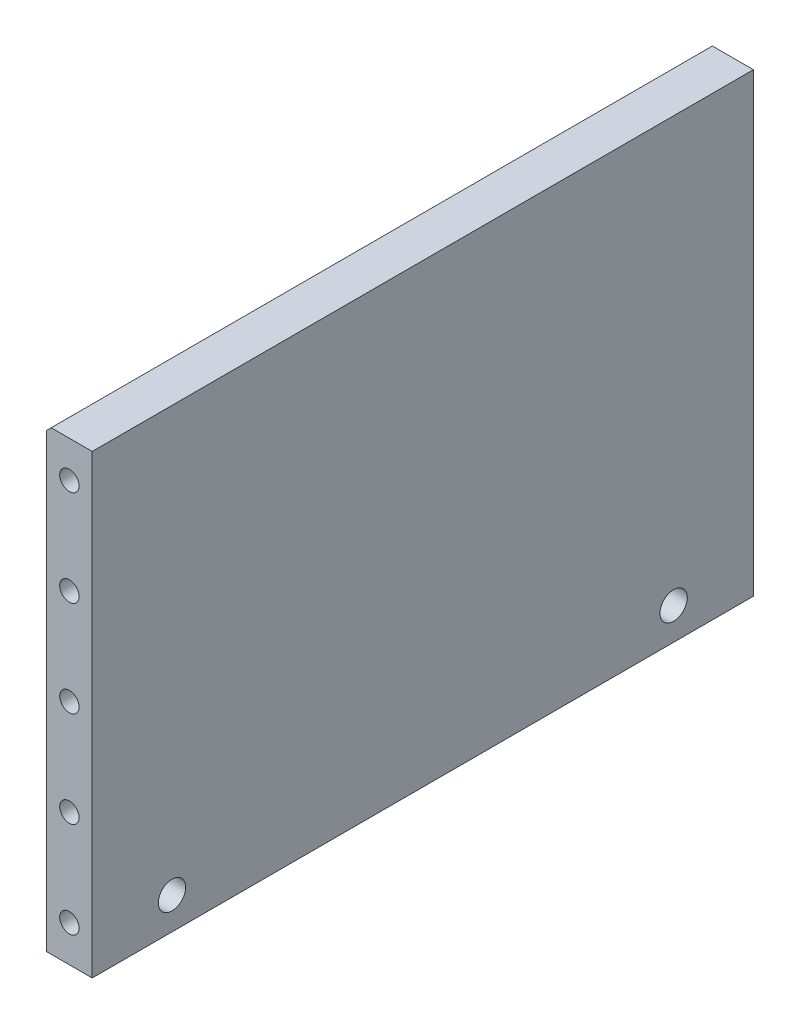
ISO-10303-21;
HEADER;
FILE_DESCRIPTION(('STEP AP214'),'2;1');
FILE_NAME('part.step','',(''),(''),'','','');
FILE_SCHEMA(('AUTOMOTIVE_DESIGN { 1 0 10303 214 1 1 1 1 }'));
ENDSEC;
DATA;
#1=APPLICATION_CONTEXT('core data for automotive mechanical design processes');
#2=APPLICATION_PROTOCOL_DEFINITION('international standard','automotive_design',2000,#1);
#3=PRODUCT_CONTEXT('',#1,'mechanical');
#4=PRODUCT('Part','Part','',(#3));
#5=PRODUCT_RELATED_PRODUCT_CATEGORY('part','',(#4));
#6=PRODUCT_DEFINITION_FORMATION('','',#4);
#7=PRODUCT_DEFINITION_CONTEXT('part definition',#1,'design');
#8=PRODUCT_DEFINITION('design','',#6,#7);
#9=PRODUCT_DEFINITION_SHAPE('','',#8);
#10=(LENGTH_UNIT() NAMED_UNIT(*) SI_UNIT(.MILLI.,.METRE.));
#11=(NAMED_UNIT(*) PLANE_ANGLE_UNIT() SI_UNIT($,.RADIAN.));
#12=(NAMED_UNIT(*) SI_UNIT($,.STERADIAN.) SOLID_ANGLE_UNIT());
#13=UNCERTAINTY_MEASURE_WITH_UNIT(LENGTH_MEASURE(1.E-05),#10,'distance_accuracy_value','');
#14=(GEOMETRIC_REPRESENTATION_CONTEXT(3) GLOBAL_UNCERTAINTY_ASSIGNED_CONTEXT((#13)) GLOBAL_UNIT_ASSIGNED_CONTEXT((#10,
#11,#12)) REPRESENTATION_CONTEXT('',''));
#15=CARTESIAN_POINT('',(0.,0.,0.));
#16=DIRECTION('',(0.,0.,1.));
#17=DIRECTION('',(1.,0.,0.));
#18=AXIS2_PLACEMENT_3D('',#15,#16,#17);
#19=CARTESIAN_POINT('',(20.,0.,0.));
#20=DIRECTION('',(0.,0.,-1.));
#21=DIRECTION('',(-1.,0.,0.));
#22=AXIS2_PLACEMENT_3D('',#19,#20,#21);
#23=PLANE('',#22);
#24=CARTESIAN_POINT('',(10.,184.,0.));
#25=DIRECTION('',(0.,0.,1.));
#26=DIRECTION('',(1.,0.,0.));
#27=AXIS2_PLACEMENT_3D('',#24,#25,#26);
#28=CIRCLE('',#27,4.24999999999999);
#29=CARTESIAN_POINT('',(14.25,184.,0.));
#30=VERTEX_POINT('',#29);
#31=EDGE_CURVE('E156',#30,#30,#28,.T.);
#32=ORIENTED_EDGE('',*,*,#31,.F.);
#33=EDGE_LOOP('',(#32));
#34=FACE_BOUND('',#33,.T.);
#35=CARTESIAN_POINT('',(10.,16.,0.));
#36=DIRECTION('',(0.,0.,1.));
#37=DIRECTION('',(1.,0.,0.));
#38=AXIS2_PLACEMENT_3D('',#35,#36,#37);
#39=CIRCLE('',#38,4.24999999999999);
#40=CARTESIAN_POINT('',(14.25,16.,0.));
#41=VERTEX_POINT('',#40);
#42=EDGE_CURVE('E162',#41,#41,#39,.T.);
#43=ORIENTED_EDGE('',*,*,#42,.F.);
#44=EDGE_LOOP('',(#43));
#45=FACE_BOUND('',#44,.T.);
#46=CARTESIAN_POINT('',(10.,58.,0.));
#47=DIRECTION('',(0.,0.,1.));
#48=DIRECTION('',(1.,0.,0.));
#49=AXIS2_PLACEMENT_3D('',#46,#47,#48);
#50=CIRCLE('',#49,4.24999999999999);
#51=CARTESIAN_POINT('',(14.25,58.,0.));
#52=VERTEX_POINT('',#51);
#53=EDGE_CURVE('E168',#52,#52,#50,.T.);
#54=ORIENTED_EDGE('',*,*,#53,.F.);
#55=EDGE_LOOP('',(#54));
#56=FACE_BOUND('',#55,.T.);
#57=CARTESIAN_POINT('',(10.,142.,0.));
#58=DIRECTION('',(0.,0.,1.));
#59=DIRECTION('',(1.,0.,0.));
#60=AXIS2_PLACEMENT_3D('',#57,#58,#59);
#61=CIRCLE('',#60,4.24999999999999);
#62=CARTESIAN_POINT('',(14.25,142.,0.));
#63=VERTEX_POINT('',#62);
#64=EDGE_CURVE('E174',#63,#63,#61,.T.);
#65=ORIENTED_EDGE('',*,*,#64,.F.);
#66=EDGE_LOOP('',(#65));
#67=FACE_BOUND('',#66,.T.);
#68=CARTESIAN_POINT('',(10.,100.,0.));
#69=DIRECTION('',(0.,0.,1.));
#70=DIRECTION('',(1.,0.,0.));
#71=AXIS2_PLACEMENT_3D('',#68,#69,#70);
#72=CIRCLE('',#71,4.24999999999999);
#73=CARTESIAN_POINT('',(14.25,100.,0.));
#74=VERTEX_POINT('',#73);
#75=EDGE_CURVE('E180',#74,#74,#72,.T.);
#76=ORIENTED_EDGE('',*,*,#75,.F.);
#77=EDGE_LOOP('',(#76));
#78=FACE_BOUND('',#77,.T.);
#79=DIRECTION('',(-1.,0.,0.));
#80=VECTOR('',#79,1.);
#81=CARTESIAN_POINT('',(20.,200.,0.));
#82=LINE('',#81,#80);
#83=CARTESIAN_POINT('',(20.,200.,0.));
#84=VERTEX_POINT('',#83);
#85=CARTESIAN_POINT('',(2.,200.,0.));
#86=VERTEX_POINT('',#85);
#87=EDGE_CURVE('E197',#84,#86,#82,.T.);
#88=ORIENTED_EDGE('',*,*,#87,.T.);
#89=DIRECTION('',(-0.707106781186543,-0.707106781186552,0.));
#90=VECTOR('',#89,1.);
#91=CARTESIAN_POINT('',(2.,200.,0.));
#92=LINE('',#91,#90);
#93=CARTESIAN_POINT('',(0.,198.,0.));
#94=VERTEX_POINT('',#93);
#95=EDGE_CURVE('E69',#86,#94,#92,.T.);
#96=ORIENTED_EDGE('',*,*,#95,.T.);
#97=DIRECTION('',(0.,-1.,0.));
#98=VECTOR('',#97,1.);
#99=CARTESIAN_POINT('',(0.,0.,0.));
#100=LINE('',#99,#98);
#101=CARTESIAN_POINT('',(0.,0.,0.));
#102=VERTEX_POINT('',#101);
#103=EDGE_CURVE('E186',#94,#102,#100,.T.);
#104=ORIENTED_EDGE('',*,*,#103,.T.);
#105=DIRECTION('',(-1.,0.,0.));
#106=VECTOR('',#105,1.);
#107=CARTESIAN_POINT('',(20.,0.,0.));
#108=LINE('',#107,#106);
#109=CARTESIAN_POINT('',(20.,0.,0.));
#110=VERTEX_POINT('',#109);
#111=EDGE_CURVE('E209',#110,#102,#108,.T.);
#112=ORIENTED_EDGE('',*,*,#111,.F.);
#113=DIRECTION('',(0.,-1.,0.));
#114=VECTOR('',#113,1.);
#115=CARTESIAN_POINT('',(20.,0.,0.));
#116=LINE('',#115,#114);
#117=EDGE_CURVE('E187',#84,#110,#116,.T.);
#118=ORIENTED_EDGE('',*,*,#117,.F.);
#119=EDGE_LOOP('',(#88,#96,#104,#112,#118));
#120=FACE_BOUND('',#119,.T.);
#121=ADVANCED_FACE('F47',(#34,#45,#56,#67,#78,#120),#23,.F.);
#122=CARTESIAN_POINT('',(20.,0.,0.));
#123=DIRECTION('',(0.,1.,0.));
#124=DIRECTION('',(0.,0.,1.));
#125=AXIS2_PLACEMENT_3D('',#122,#123,#124);
#126=PLANE('',#125);
#127=DIRECTION('',(0.,0.,-1.));
#128=VECTOR('',#127,1.);
#129=CARTESIAN_POINT('',(0.,0.,0.));
#130=LINE('',#129,#128);
#131=CARTESIAN_POINT('',(0.,0.,-290.));
#132=VERTEX_POINT('',#131);
#133=EDGE_CURVE('E199',#102,#132,#130,.T.);
#134=ORIENTED_EDGE('',*,*,#133,.T.);
#135=DIRECTION('',(-1.,0.,0.));
#136=VECTOR('',#135,1.);
#137=CARTESIAN_POINT('',(20.,0.,-290.));
#138=LINE('',#137,#136);
#139=CARTESIAN_POINT('',(20.,0.,-290.));
#140=VERTEX_POINT('',#139);
#141=EDGE_CURVE('E206',#140,#132,#138,.T.);
#142=ORIENTED_EDGE('',*,*,#141,.F.);
#143=DIRECTION('',(0.,0.,-1.));
#144=VECTOR('',#143,1.);
#145=CARTESIAN_POINT('',(20.,0.,0.));
#146=LINE('',#145,#144);
#147=EDGE_CURVE('E190',#110,#140,#146,.T.);
#148=ORIENTED_EDGE('',*,*,#147,.F.);
#149=ORIENTED_EDGE('',*,*,#111,.T.);
#150=EDGE_LOOP('',(#134,#142,#148,#149));
#151=FACE_BOUND('',#150,.T.);
#152=ADVANCED_FACE('F252',(#151),#126,.F.);
#153=CARTESIAN_POINT('',(20.,0.,-290.));
#154=DIRECTION('',(0.,0.,1.));
#155=DIRECTION('',(1.,0.,0.));
#156=AXIS2_PLACEMENT_3D('',#153,#154,#155);
#157=PLANE('',#156);
#158=CARTESIAN_POINT('',(10.,184.,-290.));
#159=DIRECTION('',(0.,0.,-1.));
#160=DIRECTION('',(-1.,0.,0.));
#161=AXIS2_PLACEMENT_3D('',#158,#159,#160);
#162=CIRCLE('',#161,4.24999999999999);
#163=CARTESIAN_POINT('',(5.75000000000001,184.,-290.));
#164=VERTEX_POINT('',#163);
#165=EDGE_CURVE('E126',#164,#164,#162,.T.);
#166=ORIENTED_EDGE('',*,*,#165,.F.);
#167=EDGE_LOOP('',(#166));
#168=FACE_BOUND('',#167,.T.);
#169=CARTESIAN_POINT('',(10.,16.,-290.));
#170=DIRECTION('',(0.,0.,-1.));
#171=DIRECTION('',(-1.,0.,0.));
#172=AXIS2_PLACEMENT_3D('',#169,#170,#171);
#173=CIRCLE('',#172,4.24999999999999);
#174=CARTESIAN_POINT('',(5.75000000000001,16.,-290.));
#175=VERTEX_POINT('',#174);
#176=EDGE_CURVE('E125',#175,#175,#173,.T.);
#177=ORIENTED_EDGE('',*,*,#176,.F.);
#178=EDGE_LOOP('',(#177));
#179=FACE_BOUND('',#178,.T.);
#180=CARTESIAN_POINT('',(10.,58.,-290.));
#181=DIRECTION('',(0.,0.,-1.));
#182=DIRECTION('',(-1.,0.,0.));
#183=AXIS2_PLACEMENT_3D('',#180,#181,#182);
#184=CIRCLE('',#183,4.24999999999999);
#185=CARTESIAN_POINT('',(5.75000000000001,58.,-290.));
#186=VERTEX_POINT('',#185);
#187=EDGE_CURVE('E138',#186,#186,#184,.T.);
#188=ORIENTED_EDGE('',*,*,#187,.F.);
#189=EDGE_LOOP('',(#188));
#190=FACE_BOUND('',#189,.T.);
#191=CARTESIAN_POINT('',(10.,142.,-290.));
#192=DIRECTION('',(0.,0.,-1.));
#193=DIRECTION('',(-1.,0.,0.));
#194=AXIS2_PLACEMENT_3D('',#191,#192,#193);
#195=CIRCLE('',#194,4.24999999999999);
#196=CARTESIAN_POINT('',(5.75000000000001,142.,-290.));
#197=VERTEX_POINT('',#196);
#198=EDGE_CURVE('E144',#197,#197,#195,.T.);
#199=ORIENTED_EDGE('',*,*,#198,.F.);
#200=EDGE_LOOP('',(#199));
#201=FACE_BOUND('',#200,.T.);
#202=CARTESIAN_POINT('',(10.,100.,-290.));
#203=DIRECTION('',(0.,0.,-1.));
#204=DIRECTION('',(-1.,0.,0.));
#205=AXIS2_PLACEMENT_3D('',#202,#203,#204);
#206=CIRCLE('',#205,4.24999999999999);
#207=CARTESIAN_POINT('',(5.75000000000001,100.,-290.));
#208=VERTEX_POINT('',#207);
#209=EDGE_CURVE('E150',#208,#208,#206,.T.);
#210=ORIENTED_EDGE('',*,*,#209,.F.);
#211=EDGE_LOOP('',(#210));
#212=FACE_BOUND('',#211,.T.);
#213=DIRECTION('',(0.,1.,0.));
#214=VECTOR('',#213,1.);
#215=CARTESIAN_POINT('',(0.,0.,-290.));
#216=LINE('',#215,#214);
#217=CARTESIAN_POINT('',(0.,198.,-290.));
#218=VERTEX_POINT('',#217);
#219=EDGE_CURVE('E191',#132,#218,#216,.T.);
#220=ORIENTED_EDGE('',*,*,#219,.T.);
#221=DIRECTION('',(0.707106781186543,0.707106781186552,0.));
#222=VECTOR('',#221,1.);
#223=CARTESIAN_POINT('',(2.,200.,-290.));
#224=LINE('',#223,#222);
#225=CARTESIAN_POINT('',(2.,200.,-290.));
#226=VERTEX_POINT('',#225);
#227=EDGE_CURVE('E11',#218,#226,#224,.T.);
#228=ORIENTED_EDGE('',*,*,#227,.T.);
#229=DIRECTION('',(-1.,0.,0.));
#230=VECTOR('',#229,1.);
#231=CARTESIAN_POINT('',(20.,200.,-290.));
#232=LINE('',#231,#230);
#233=CARTESIAN_POINT('',(20.,200.,-290.));
#234=VERTEX_POINT('',#233);
#235=EDGE_CURVE('E203',#234,#226,#232,.T.);
#236=ORIENTED_EDGE('',*,*,#235,.F.);
#237=DIRECTION('',(0.,1.,0.));
#238=VECTOR('',#237,1.);
#239=CARTESIAN_POINT('',(20.,0.,-290.));
#240=LINE('',#239,#238);
#241=EDGE_CURVE('E193',#140,#234,#240,.T.);
#242=ORIENTED_EDGE('',*,*,#241,.F.);
#243=ORIENTED_EDGE('',*,*,#141,.T.);
#244=EDGE_LOOP('',(#220,#228,#236,#242,#243));
#245=FACE_BOUND('',#244,.T.);
#246=ADVANCED_FACE('F259',(#168,#179,#190,#201,#212,#245),#157,.F.);
#247=CARTESIAN_POINT('',(20.,200.,0.));
#248=DIRECTION('',(0.,-1.,0.));
#249=DIRECTION('',(0.,0.,-1.));
#250=AXIS2_PLACEMENT_3D('',#247,#248,#249);
#251=PLANE('',#250);
#252=ORIENTED_EDGE('',*,*,#235,.T.);
#253=DIRECTION('',(0.,0.,1.));
#254=VECTOR('',#253,1.);
#255=CARTESIAN_POINT('',(2.,200.,0.));
#256=LINE('',#255,#254);
#257=EDGE_CURVE('E212',#226,#86,#256,.T.);
#258=ORIENTED_EDGE('',*,*,#257,.T.);
#259=ORIENTED_EDGE('',*,*,#87,.F.);
#260=DIRECTION('',(0.,0.,1.));
#261=VECTOR('',#260,1.);
#262=CARTESIAN_POINT('',(20.,200.,0.));
#263=LINE('',#262,#261);
#264=EDGE_CURVE('E195',#234,#84,#263,.T.);
#265=ORIENTED_EDGE('',*,*,#264,.F.);
#266=EDGE_LOOP('',(#252,#258,#259,#265));
#267=FACE_BOUND('',#266,.T.);
#268=ADVANCED_FACE('F266',(#267),#251,.F.);
#269=CARTESIAN_POINT('',(20.,200.,0.));
#270=DIRECTION('',(-1.,0.,0.));
#271=DIRECTION('',(0.,0.,1.));
#272=AXIS2_PLACEMENT_3D('',#269,#270,#271);
#273=PLANE('',#272);
#274=CARTESIAN_POINT('',(20.,14.,-35.));
#275=DIRECTION('',(1.,0.,0.));
#276=DIRECTION('',(0.,0.,-1.));
#277=AXIS2_PLACEMENT_3D('',#274,#275,#276);
#278=CIRCLE('',#277,5.99999999999999);
#279=CARTESIAN_POINT('',(20.,14.,-41.));
#280=VERTEX_POINT('',#279);
#281=EDGE_CURVE('E378',#280,#280,#278,.T.);
#282=ORIENTED_EDGE('',*,*,#281,.F.);
#283=EDGE_LOOP('',(#282));
#284=FACE_BOUND('',#283,.T.);
#285=CARTESIAN_POINT('',(20.,14.,-255.));
#286=DIRECTION('',(1.,0.,0.));
#287=DIRECTION('',(0.,0.,-1.));
#288=AXIS2_PLACEMENT_3D('',#285,#286,#287);
#289=CIRCLE('',#288,5.99999999999999);
#290=CARTESIAN_POINT('',(20.,14.,-261.));
#291=VERTEX_POINT('',#290);
#292=EDGE_CURVE('E221',#291,#291,#289,.T.);
#293=ORIENTED_EDGE('',*,*,#292,.F.);
#294=EDGE_LOOP('',(#293));
#295=FACE_BOUND('',#294,.T.);
#296=ORIENTED_EDGE('',*,*,#117,.T.);
#297=ORIENTED_EDGE('',*,*,#147,.T.);
#298=ORIENTED_EDGE('',*,*,#241,.T.);
#299=ORIENTED_EDGE('',*,*,#264,.T.);
#300=EDGE_LOOP('',(#296,#297,#298,#299));
#301=FACE_BOUND('',#300,.T.);
#302=ADVANCED_FACE('F270',(#284,#295,#301),#273,.F.);
#303=CARTESIAN_POINT('',(0.,200.,0.));
#304=DIRECTION('',(-1.,0.,0.));
#305=DIRECTION('',(0.,0.,1.));
#306=AXIS2_PLACEMENT_3D('',#303,#304,#305);
#307=PLANE('',#306);
#308=CARTESIAN_POINT('',(0.,14.,-35.));
#309=DIRECTION('',(-1.,0.,0.));
#310=DIRECTION('',(0.,0.,1.));
#311=AXIS2_PLACEMENT_3D('',#308,#309,#310);
#312=CIRCLE('',#311,5.99999999999999);
#313=CARTESIAN_POINT('',(0.,14.,-29.));
#314=VERTEX_POINT('',#313);
#315=EDGE_CURVE('E374',#314,#314,#312,.T.);
#316=ORIENTED_EDGE('',*,*,#315,.F.);
#317=EDGE_LOOP('',(#316));
#318=FACE_BOUND('',#317,.T.);
#319=CARTESIAN_POINT('',(0.,14.,-255.));
#320=DIRECTION('',(-1.,0.,0.));
#321=DIRECTION('',(0.,0.,1.));
#322=AXIS2_PLACEMENT_3D('',#319,#320,#321);
#323=CIRCLE('',#322,5.99999999999999);
#324=CARTESIAN_POINT('',(0.,14.,-249.));
#325=VERTEX_POINT('',#324);
#326=EDGE_CURVE('E132',#325,#325,#323,.T.);
#327=ORIENTED_EDGE('',*,*,#326,.F.);
#328=EDGE_LOOP('',(#327));
#329=FACE_BOUND('',#328,.T.);
#330=ORIENTED_EDGE('',*,*,#103,.F.);
#331=DIRECTION('',(0.,0.,-1.));
#332=VECTOR('',#331,1.);
#333=CARTESIAN_POINT('',(0.,198.,-290.));
#334=LINE('',#333,#332);
#335=EDGE_CURVE('E55',#94,#218,#334,.T.);
#336=ORIENTED_EDGE('',*,*,#335,.T.);
#337=ORIENTED_EDGE('',*,*,#219,.F.);
#338=ORIENTED_EDGE('',*,*,#133,.F.);
#339=EDGE_LOOP('',(#330,#336,#337,#338));
#340=FACE_BOUND('',#339,.T.);
#341=ADVANCED_FACE('F272',(#318,#329,#340),#307,.T.);
#342=CARTESIAN_POINT('',(10.,100.,-27.5));
#343=DIRECTION('',(0.,0.,1.));
#344=DIRECTION('',(1.,0.,0.));
#345=AXIS2_PLACEMENT_3D('',#342,#343,#344);
#346=CONICAL_SURFACE('',#345,4.24999999999999,1.02974425867665);
#347=CARTESIAN_POINT('',(9.99999999999999,100.,-30.0536576308671));
#348=VERTEX_POINT('',#347);
#349=VERTEX_LOOP('',#348);
#350=FACE_BOUND('',#349,.T.);
#351=CARTESIAN_POINT('',(10.,100.,-27.5));
#352=DIRECTION('',(0.,0.,1.));
#353=DIRECTION('',(1.,0.,0.));
#354=AXIS2_PLACEMENT_3D('',#351,#352,#353);
#355=CIRCLE('',#354,4.24999999999999);
#356=CARTESIAN_POINT('',(14.25,100.,-27.5));
#357=VERTEX_POINT('',#356);
#358=EDGE_CURVE('E183',#357,#357,#355,.T.);
#359=ORIENTED_EDGE('',*,*,#358,.T.);
#360=EDGE_LOOP('',(#359));
#361=FACE_BOUND('',#360,.T.);
#362=ADVANCED_FACE('F275',(#350,#361),#346,.F.);
#363=CARTESIAN_POINT('',(10.,100.,0.));
#364=DIRECTION('',(0.,0.,1.));
#365=DIRECTION('',(1.,0.,0.));
#366=AXIS2_PLACEMENT_3D('',#363,#364,#365);
#367=CYLINDRICAL_SURFACE('',#366,4.24999999999999);
#368=ORIENTED_EDGE('',*,*,#358,.F.);
#369=EDGE_LOOP('',(#368));
#370=FACE_BOUND('',#369,.T.);
#371=ORIENTED_EDGE('',*,*,#75,.T.);
#372=EDGE_LOOP('',(#371));
#373=FACE_BOUND('',#372,.T.);
#374=ADVANCED_FACE('F282',(#370,#373),#367,.F.);
#375=CARTESIAN_POINT('',(10.,142.,-27.5));
#376=DIRECTION('',(0.,0.,1.));
#377=DIRECTION('',(1.,0.,0.));
#378=AXIS2_PLACEMENT_3D('',#375,#376,#377);
#379=CONICAL_SURFACE('',#378,4.24999999999999,1.02974425867665);
#380=CARTESIAN_POINT('',(9.99999999999999,142.,-30.0536576308671));
#381=VERTEX_POINT('',#380);
#382=VERTEX_LOOP('',#381);
#383=FACE_BOUND('',#382,.T.);
#384=CARTESIAN_POINT('',(10.,142.,-27.5));
#385=DIRECTION('',(0.,0.,1.));
#386=DIRECTION('',(1.,0.,0.));
#387=AXIS2_PLACEMENT_3D('',#384,#385,#386);
#388=CIRCLE('',#387,4.24999999999999);
#389=CARTESIAN_POINT('',(14.25,142.,-27.5));
#390=VERTEX_POINT('',#389);
#391=EDGE_CURVE('E177',#390,#390,#388,.T.);
#392=ORIENTED_EDGE('',*,*,#391,.T.);
#393=EDGE_LOOP('',(#392));
#394=FACE_BOUND('',#393,.T.);
#395=ADVANCED_FACE('F286',(#383,#394),#379,.F.);
#396=CARTESIAN_POINT('',(10.,142.,0.));
#397=DIRECTION('',(0.,0.,1.));
#398=DIRECTION('',(1.,0.,0.));
#399=AXIS2_PLACEMENT_3D('',#396,#397,#398);
#400=CYLINDRICAL_SURFACE('',#399,4.24999999999999);
#401=ORIENTED_EDGE('',*,*,#391,.F.);
#402=EDGE_LOOP('',(#401));
#403=FACE_BOUND('',#402,.T.);
#404=ORIENTED_EDGE('',*,*,#64,.T.);
#405=EDGE_LOOP('',(#404));
#406=FACE_BOUND('',#405,.T.);
#407=ADVANCED_FACE('F290',(#403,#406),#400,.F.);
#408=CARTESIAN_POINT('',(10.,58.,-27.5));
#409=DIRECTION('',(0.,0.,1.));
#410=DIRECTION('',(1.,0.,0.));
#411=AXIS2_PLACEMENT_3D('',#408,#409,#410);
#412=CONICAL_SURFACE('',#411,4.24999999999999,1.02974425867665);
#413=CARTESIAN_POINT('',(9.99999999999999,58.,-30.0536576308671));
#414=VERTEX_POINT('',#413);
#415=VERTEX_LOOP('',#414);
#416=FACE_BOUND('',#415,.T.);
#417=CARTESIAN_POINT('',(10.,58.,-27.5));
#418=DIRECTION('',(0.,0.,1.));
#419=DIRECTION('',(1.,0.,0.));
#420=AXIS2_PLACEMENT_3D('',#417,#418,#419);
#421=CIRCLE('',#420,4.24999999999999);
#422=CARTESIAN_POINT('',(14.25,58.,-27.5));
#423=VERTEX_POINT('',#422);
#424=EDGE_CURVE('E171',#423,#423,#421,.T.);
#425=ORIENTED_EDGE('',*,*,#424,.T.);
#426=EDGE_LOOP('',(#425));
#427=FACE_BOUND('',#426,.T.);
#428=ADVANCED_FACE('F294',(#416,#427),#412,.F.);
#429=CARTESIAN_POINT('',(10.,58.,0.));
#430=DIRECTION('',(0.,0.,1.));
#431=DIRECTION('',(1.,0.,0.));
#432=AXIS2_PLACEMENT_3D('',#429,#430,#431);
#433=CYLINDRICAL_SURFACE('',#432,4.24999999999999);
#434=ORIENTED_EDGE('',*,*,#424,.F.);
#435=EDGE_LOOP('',(#434));
#436=FACE_BOUND('',#435,.T.);
#437=ORIENTED_EDGE('',*,*,#53,.T.);
#438=EDGE_LOOP('',(#437));
#439=FACE_BOUND('',#438,.T.);
#440=ADVANCED_FACE('F298',(#436,#439),#433,.F.);
#441=CARTESIAN_POINT('',(10.,16.,-27.5));
#442=DIRECTION('',(0.,0.,1.));
#443=DIRECTION('',(1.,0.,0.));
#444=AXIS2_PLACEMENT_3D('',#441,#442,#443);
#445=CONICAL_SURFACE('',#444,4.24999999999999,1.02974425867665);
#446=CARTESIAN_POINT('',(8.87440916931204,14.7629046936816,-29.0486990014968));
#447=CARTESIAN_POINT('',(8.83800836371475,14.8094561464174,-29.0546668345114));
#448=CARTESIAN_POINT('',(8.80529993592373,14.8588488395052,-29.0615561672032));
#449=CARTESIAN_POINT('',(8.74862107173418,14.9621547241457,-29.0774174847769));
#450=CARTESIAN_POINT('',(8.72465607260577,15.016070703049,-29.0863907599423));
#451=CARTESIAN_POINT('',(8.68635894552179,15.126898702028,-29.1065062031721));
#452=CARTESIAN_POINT('',(8.67203450092444,15.1838130729134,-29.1176500920806));
#453=CARTESIAN_POINT('',(8.6533219698874,15.2988093569091,-29.1419672109219));
#454=CARTESIAN_POINT('',(8.64893391034722,15.3568912731797,-29.1551404463485));
#455=CARTESIAN_POINT('',(8.64970835588915,15.4720138991943,-29.1830717079676));
#456=CARTESIAN_POINT('',(8.65478428687548,15.5290592741078,-29.1978142164227));
#457=CARTESIAN_POINT('',(8.67351734926935,15.6413508250015,-29.2285735640428));
#458=CARTESIAN_POINT('',(8.68717776620187,15.6965963035914,-29.2445908890653));
#459=CARTESIAN_POINT('',(8.724198217075,15.8107449148441,-29.279407969013));
#460=CARTESIAN_POINT('',(8.74851775978971,15.8693028881037,-29.2983122186804));
#461=CARTESIAN_POINT('',(8.80539638428523,15.9821058678619,-29.3365370738267));
#462=CARTESIAN_POINT('',(8.83796004213634,16.0363484569666,-29.3558579050712));
#463=CARTESIAN_POINT('',(8.91686297970429,16.149392072982,-29.3978237214249));
#464=CARTESIAN_POINT('',(8.96463257237574,16.2072115988718,-29.4204301959215));
#465=CARTESIAN_POINT('',(9.06886803761814,16.3151024985527,-29.4643246311775));
#466=CARTESIAN_POINT('',(9.12534569622124,16.3651631841253,-29.4856107493009));
#467=CARTESIAN_POINT('',(9.25277596263422,16.4615355892712,-29.5278971126512));
#468=CARTESIAN_POINT('',(9.32464304759967,16.5067847048986,-29.5485933377753));
#469=CARTESIAN_POINT('',(9.47634926531101,16.5840015191017,-29.5847652510506));
#470=CARTESIAN_POINT('',(9.55617183549935,16.6159961242488,-29.6002515032774));
#471=CARTESIAN_POINT('',(9.70106874142829,16.6582225169465,-29.6209423650426));
#472=CARTESIAN_POINT('',(9.76492090647468,16.6718765743835,-29.6277412151227));
#473=CARTESIAN_POINT('',(9.89426595906153,16.6893080775659,-29.6364449305019));
#474=CARTESIAN_POINT('',(9.9597571761547,16.6930951960578,-29.6383545887363));
#475=CARTESIAN_POINT('',(10.0905225109277,16.6905108898551,-29.6370575166072));
#476=CARTESIAN_POINT('',(10.1557964600679,16.68413286875,-29.6338474639359));
#477=CARTESIAN_POINT('',(10.2842509815329,16.6616948429696,-29.6226835400261));
#478=CARTESIAN_POINT('',(10.347429991173,16.6456277750158,-29.6147262080843));
#479=CARTESIAN_POINT('',(10.4708968678249,16.6046005171674,-29.5947639418588));
#480=CARTESIAN_POINT('',(10.5311454359874,16.5795447431968,-29.5827155810847));
#481=CARTESIAN_POINT('',(10.6470543240292,16.5217291296348,-29.555562415644));
#482=CARTESIAN_POINT('',(10.702713122743,16.4889667496291,-29.5404566033451));
#483=CARTESIAN_POINT('',(10.8176710907142,16.4106749584318,-29.505386466377));
#484=CARTESIAN_POINT('',(10.876021986753,16.3639266841408,-29.4850321064683));
#485=CARTESIAN_POINT('',(10.984678412822,16.2624191745507,-29.4426183674477));
#486=CARTESIAN_POINT('',(11.0349734501863,16.2076496664996,-29.4205568192968));
#487=CARTESIAN_POINT('',(11.1319234369575,16.0838044351822,-29.3730396130298));
#488=CARTESIAN_POINT('',(11.1773609124565,16.0137972134451,-29.3475013743238));
#489=CARTESIAN_POINT('',(11.2540780837077,15.8662116116697,-29.297080023345));
#490=CARTESIAN_POINT('',(11.2853822077235,15.7886465790501,-29.2721958512514));
#491=CARTESIAN_POINT('',(11.3248389287042,15.6494847720236,-29.2308592391362));
#492=CARTESIAN_POINT('',(11.3369392242232,15.5891456453679,-29.2139279001328));
#493=CARTESIAN_POINT('',(11.3507855542692,15.4668544981731,-29.1817253647139));
#494=CARTESIAN_POINT('',(11.3525413304213,15.404904050297,-29.1664526196813));
#495=CARTESIAN_POINT('',(11.3448547292978,15.2808527885246,-29.1379623031101));
#496=CARTESIAN_POINT('',(11.335354629723,15.218752843552,-29.1247557218202));
#497=CARTESIAN_POINT('',(11.3049293463068,15.0969174704128,-29.100794354468));
#498=CARTESIAN_POINT('',(11.2840060566954,15.03718165198,-29.0900391623275));
#499=CARTESIAN_POINT('',(11.2337095177513,14.9269950623762,-29.0718008745307));
#500=CARTESIAN_POINT('',(11.2051856754778,14.8761853661438,-29.0641198000512));
#501=CARTESIAN_POINT('',(11.1403041051495,14.7795830267002,-29.0506611850585));
#502=CARTESIAN_POINT('',(11.1039452848864,14.7337910843157,-29.0448839102223));
#503=CARTESIAN_POINT('',(11.0230319675438,14.6462303537067,-29.0347325110487));
#504=CARTESIAN_POINT('',(10.9781934579404,14.6047173918011,-29.0304289652943));
#505=CARTESIAN_POINT('',(10.8829535617576,14.5285425519924,-29.0232024692381));
#506=CARTESIAN_POINT('',(10.8325497909405,14.4938836283436,-29.0202801135111));
#507=CARTESIAN_POINT('',(10.719825880114,14.4270348210552,-29.0151082529313));
#508=CARTESIAN_POINT('',(10.6568423359137,14.3959530063793,-29.0130203433544));
#509=CARTESIAN_POINT('',(10.5270839450785,14.3430596210466,-29.0097570932081));
#510=CARTESIAN_POINT('',(10.4603069164345,14.321253448203,-29.0085822836747));
#511=CARTESIAN_POINT('',(10.3132146229438,14.2839959959873,-29.0066906246934));
#512=CARTESIAN_POINT('',(10.2324809320175,14.2701827584995,-29.0060810614417));
#513=CARTESIAN_POINT('',(10.0698216631571,14.254909529685,-29.0054128563261));
#514=CARTESIAN_POINT('',(9.9878952290352,14.2534588999228,-29.005354631959));
#515=CARTESIAN_POINT('',(9.81646300795536,14.2633929148134,-29.0057811170289));
#516=CARTESIAN_POINT('',(9.72702991997771,14.2760923438114,-29.006321409837));
#517=CARTESIAN_POINT('',(9.55161916627027,14.3166461638656,-29.0083266516871));
#518=CARTESIAN_POINT('',(9.46564104006893,14.3444985281217,-29.0097914770711));
#519=CARTESIAN_POINT('',(9.31542185713359,14.4089987028035,-29.0138865187576));
#520=CARTESIAN_POINT('',(9.25008017711622,14.443108227069,-29.0162547739821));
#521=CARTESIAN_POINT('',(9.12598030396448,14.5214504149322,-29.0225735989656));
#522=CARTESIAN_POINT('',(9.0672030057201,14.565652497654,-29.0265194152342));
#523=CARTESIAN_POINT('',(8.9877520544764,14.6373427053332,-29.0339031575541));
#524=CARTESIAN_POINT('',(8.96354857151618,14.6610815150913,-29.036478613775));
#525=CARTESIAN_POINT('',(8.91729576140837,14.7105374659195,-29.0421682173731));
#526=CARTESIAN_POINT('',(8.89524743484233,14.7362555160875,-29.0452826131241));
#527=CARTESIAN_POINT('',(8.87440916931204,14.7629046936816,-29.0486990014968));
#528=B_SPLINE_CURVE_WITH_KNOTS('',3,(#446,#447,#448,#449,#450,#451,#452,#453,#454,#455,#456,
#457,#458,#459,#460,#461,#462,#463,#464,#465,#466,#467,#468,#469,#470,#471,#472,#473,#474,#475,
#476,#477,#478,#479,#480,#481,#482,#483,#484,#485,#486,#487,#488,#489,#490,#491,#492,#493,#494,
#495,#496,#497,#498,#499,#500,#501,#502,#503,#504,#505,#506,#507,#508,#509,#510,#511,#512,#513,
#514,#515,#516,#517,#518,#519,#520,#521,#522,#523,#524,#525,#526,#527),.UNSPECIFIED.,.T.,.F.,(4,
2,2,2,2,2,2,2,2,2,2,2,2,2,2,2,2,2,2,2,2,2,2,2,2,2,2,2,2,2,2,2,2,2,2,2,2,2,2,2,4),(0.,
0.178063834249584,0.35623821295084,0.534554425977419,0.71287112173619,0.889564620931615,
1.06632578693501,1.26408589868382,1.46195602295918,1.69602557604129,1.93041476018869,
2.19128596779889,2.45162498242741,2.64771208484489,2.84360688691843,3.03962886173895,
3.23579390887539,3.43410996908311,3.63249149426139,3.86405505747265,4.09591781916914,
4.35642733023245,4.6164848332366,4.80719249863804,4.99772054236385,5.18922989454936,
5.38070749968085,5.55622954999811,5.73177608421492,5.91483052385588,6.09796369318366,
6.30796206243583,6.51808247028739,6.76280776485465,7.0077183607984,7.27743252660916,
7.54711062532646,7.76749485790672,7.98721997631299,8.08910859078418,8.19104428694668),.UNSPECIFIED.);
#529=CARTESIAN_POINT('',(8.87440916931204,14.7629046936816,-29.0486990014968));
#530=VERTEX_POINT('',#529);
#531=EDGE_CURVE('E222',#530,#530,#528,.T.);
#532=ORIENTED_EDGE('',*,*,#531,.T.);
#533=EDGE_LOOP('',(#532));
#534=FACE_BOUND('',#533,.T.);
#535=CARTESIAN_POINT('',(10.,16.,-27.5));
#536=DIRECTION('',(0.,0.,1.));
#537=DIRECTION('',(1.,0.,0.));
#538=AXIS2_PLACEMENT_3D('',#535,#536,#537);
#539=CIRCLE('',#538,4.24999999999999);
#540=CARTESIAN_POINT('',(14.25,16.,-27.5));
#541=VERTEX_POINT('',#540);
#542=EDGE_CURVE('E165',#541,#541,#539,.T.);
#543=ORIENTED_EDGE('',*,*,#542,.T.);
#544=EDGE_LOOP('',(#543));
#545=FACE_BOUND('',#544,.T.);
#546=ADVANCED_FACE('F301',(#534,#545),#445,.F.);
#547=CARTESIAN_POINT('',(10.,16.,0.));
#548=DIRECTION('',(0.,0.,1.));
#549=DIRECTION('',(1.,0.,0.));
#550=AXIS2_PLACEMENT_3D('',#547,#548,#549);
#551=CYLINDRICAL_SURFACE('',#550,4.24999999999999);
#552=ORIENTED_EDGE('',*,*,#542,.F.);
#553=EDGE_LOOP('',(#552));
#554=FACE_BOUND('',#553,.T.);
#555=ORIENTED_EDGE('',*,*,#42,.T.);
#556=EDGE_LOOP('',(#555));
#557=FACE_BOUND('',#556,.T.);
#558=ADVANCED_FACE('F306',(#554,#557),#551,.F.);
#559=CARTESIAN_POINT('',(10.,184.,-27.5));
#560=DIRECTION('',(0.,0.,1.));
#561=DIRECTION('',(1.,0.,0.));
#562=AXIS2_PLACEMENT_3D('',#559,#560,#561);
#563=CONICAL_SURFACE('',#562,4.24999999999999,1.02974425867665);
#564=CARTESIAN_POINT('',(9.99999999999999,184.,-30.0536576308671));
#565=VERTEX_POINT('',#564);
#566=VERTEX_LOOP('',#565);
#567=FACE_BOUND('',#566,.T.);
#568=CARTESIAN_POINT('',(10.,184.,-27.5));
#569=DIRECTION('',(0.,0.,1.));
#570=DIRECTION('',(1.,0.,0.));
#571=AXIS2_PLACEMENT_3D('',#568,#569,#570);
#572=CIRCLE('',#571,4.24999999999999);
#573=CARTESIAN_POINT('',(14.25,184.,-27.5));
#574=VERTEX_POINT('',#573);
#575=EDGE_CURVE('E159',#574,#574,#572,.T.);
#576=ORIENTED_EDGE('',*,*,#575,.T.);
#577=EDGE_LOOP('',(#576));
#578=FACE_BOUND('',#577,.T.);
#579=ADVANCED_FACE('F310',(#567,#578),#563,.F.);
#580=CARTESIAN_POINT('',(10.,184.,0.));
#581=DIRECTION('',(0.,0.,1.));
#582=DIRECTION('',(1.,0.,0.));
#583=AXIS2_PLACEMENT_3D('',#580,#581,#582);
#584=CYLINDRICAL_SURFACE('',#583,4.24999999999999);
#585=ORIENTED_EDGE('',*,*,#575,.F.);
#586=EDGE_LOOP('',(#585));
#587=FACE_BOUND('',#586,.T.);
#588=ORIENTED_EDGE('',*,*,#31,.T.);
#589=EDGE_LOOP('',(#588));
#590=FACE_BOUND('',#589,.T.);
#591=ADVANCED_FACE('F314',(#587,#590),#584,.F.);
#592=CARTESIAN_POINT('',(10.,100.,-262.5));
#593=DIRECTION('',(0.,0.,-1.));
#594=DIRECTION('',(-1.,0.,0.));
#595=AXIS2_PLACEMENT_3D('',#592,#593,#594);
#596=CONICAL_SURFACE('',#595,4.24999999999999,1.02974425867665);
#597=CARTESIAN_POINT('',(9.99999999999999,100.,-259.946342369133));
#598=VERTEX_POINT('',#597);
#599=VERTEX_LOOP('',#598);
#600=FACE_BOUND('',#599,.T.);
#601=CARTESIAN_POINT('',(10.,100.,-262.5));
#602=DIRECTION('',(0.,0.,-1.));
#603=DIRECTION('',(-1.,0.,0.));
#604=AXIS2_PLACEMENT_3D('',#601,#602,#603);
#605=CIRCLE('',#604,4.24999999999999);
#606=CARTESIAN_POINT('',(5.75000000000001,100.,-262.5));
#607=VERTEX_POINT('',#606);
#608=EDGE_CURVE('E153',#607,#607,#605,.T.);
#609=ORIENTED_EDGE('',*,*,#608,.T.);
#610=EDGE_LOOP('',(#609));
#611=FACE_BOUND('',#610,.T.);
#612=ADVANCED_FACE('F318',(#600,#611),#596,.F.);
#613=CARTESIAN_POINT('',(10.,100.,-290.));
#614=DIRECTION('',(0.,0.,-1.));
#615=DIRECTION('',(-1.,0.,0.));
#616=AXIS2_PLACEMENT_3D('',#613,#614,#615);
#617=CYLINDRICAL_SURFACE('',#616,4.24999999999999);
#618=ORIENTED_EDGE('',*,*,#608,.F.);
#619=EDGE_LOOP('',(#618));
#620=FACE_BOUND('',#619,.T.);
#621=ORIENTED_EDGE('',*,*,#209,.T.);
#622=EDGE_LOOP('',(#621));
#623=FACE_BOUND('',#622,.T.);
#624=ADVANCED_FACE('F322',(#620,#623),#617,.F.);
#625=CARTESIAN_POINT('',(10.,142.,-262.5));
#626=DIRECTION('',(0.,0.,-1.));
#627=DIRECTION('',(-1.,0.,0.));
#628=AXIS2_PLACEMENT_3D('',#625,#626,#627);
#629=CONICAL_SURFACE('',#628,4.24999999999999,1.02974425867665);
#630=CARTESIAN_POINT('',(9.99999999999999,142.,-259.946342369133));
#631=VERTEX_POINT('',#630);
#632=VERTEX_LOOP('',#631);
#633=FACE_BOUND('',#632,.T.);
#634=CARTESIAN_POINT('',(10.,142.,-262.5));
#635=DIRECTION('',(0.,0.,-1.));
#636=DIRECTION('',(-1.,0.,0.));
#637=AXIS2_PLACEMENT_3D('',#634,#635,#636);
#638=CIRCLE('',#637,4.24999999999999);
#639=CARTESIAN_POINT('',(5.75000000000001,142.,-262.5));
#640=VERTEX_POINT('',#639);
#641=EDGE_CURVE('E147',#640,#640,#638,.T.);
#642=ORIENTED_EDGE('',*,*,#641,.T.);
#643=EDGE_LOOP('',(#642));
#644=FACE_BOUND('',#643,.T.);
#645=ADVANCED_FACE('F326',(#633,#644),#629,.F.);
#646=CARTESIAN_POINT('',(10.,142.,-290.));
#647=DIRECTION('',(0.,0.,-1.));
#648=DIRECTION('',(-1.,0.,0.));
#649=AXIS2_PLACEMENT_3D('',#646,#647,#648);
#650=CYLINDRICAL_SURFACE('',#649,4.24999999999999);
#651=ORIENTED_EDGE('',*,*,#641,.F.);
#652=EDGE_LOOP('',(#651));
#653=FACE_BOUND('',#652,.T.);
#654=ORIENTED_EDGE('',*,*,#198,.T.);
#655=EDGE_LOOP('',(#654));
#656=FACE_BOUND('',#655,.T.);
#657=ADVANCED_FACE('F330',(#653,#656),#650,.F.);
#658=CARTESIAN_POINT('',(10.,58.,-262.5));
#659=DIRECTION('',(0.,0.,-1.));
#660=DIRECTION('',(-1.,0.,0.));
#661=AXIS2_PLACEMENT_3D('',#658,#659,#660);
#662=CONICAL_SURFACE('',#661,4.24999999999999,1.02974425867665);
#663=CARTESIAN_POINT('',(9.99999999999999,58.,-259.946342369133));
#664=VERTEX_POINT('',#663);
#665=VERTEX_LOOP('',#664);
#666=FACE_BOUND('',#665,.T.);
#667=CARTESIAN_POINT('',(10.,58.,-262.5));
#668=DIRECTION('',(0.,0.,-1.));
#669=DIRECTION('',(-1.,0.,0.));
#670=AXIS2_PLACEMENT_3D('',#667,#668,#669);
#671=CIRCLE('',#670,4.24999999999999);
#672=CARTESIAN_POINT('',(5.75000000000001,58.,-262.5));
#673=VERTEX_POINT('',#672);
#674=EDGE_CURVE('E141',#673,#673,#671,.T.);
#675=ORIENTED_EDGE('',*,*,#674,.T.);
#676=EDGE_LOOP('',(#675));
#677=FACE_BOUND('',#676,.T.);
#678=ADVANCED_FACE('F334',(#666,#677),#662,.F.);
#679=CARTESIAN_POINT('',(10.,58.,-290.));
#680=DIRECTION('',(0.,0.,-1.));
#681=DIRECTION('',(-1.,0.,0.));
#682=AXIS2_PLACEMENT_3D('',#679,#680,#681);
#683=CYLINDRICAL_SURFACE('',#682,4.24999999999999);
#684=ORIENTED_EDGE('',*,*,#674,.F.);
#685=EDGE_LOOP('',(#684));
#686=FACE_BOUND('',#685,.T.);
#687=ORIENTED_EDGE('',*,*,#187,.T.);
#688=EDGE_LOOP('',(#687));
#689=FACE_BOUND('',#688,.T.);
#690=ADVANCED_FACE('F247',(#686,#689),#683,.F.);
#691=CARTESIAN_POINT('',(10.,16.,-262.5));
#692=DIRECTION('',(0.,0.,-1.));
#693=DIRECTION('',(-1.,0.,0.));
#694=AXIS2_PLACEMENT_3D('',#691,#692,#693);
#695=CONICAL_SURFACE('',#694,4.24999999999999,1.02974425867665);
#696=CARTESIAN_POINT('',(8.87440916931196,14.7629046936815,-260.951300998503));
#697=CARTESIAN_POINT('',(8.92153305275235,14.7026511695679,-260.959025713227));
#698=CARTESIAN_POINT('',(8.97491161177837,14.6470898428157,-260.965216083215));
#699=CARTESIAN_POINT('',(9.09111756623864,14.5466958905764,-260.975256088864));
#700=CARTESIAN_POINT('',(9.15395656364399,14.5018766161912,-260.979102820719));
#701=CARTESIAN_POINT('',(9.27908347918846,14.4276897989768,-260.984839890029));
#702=CARTESIAN_POINT('',(9.34069404585114,14.3971745132236,-260.986896987247));
#703=CARTESIAN_POINT('',(9.46752746745969,14.3450517880269,-260.990126855651));
#704=CARTESIAN_POINT('',(9.53274848062243,14.3234398533968,-260.991300073344));
#705=CARTESIAN_POINT('',(9.67803593802033,14.2857605050517,-260.993226961121));
#706=CARTESIAN_POINT('',(9.7585782989333,14.2715131594784,-260.993859418521));
#707=CARTESIAN_POINT('',(9.92095229953667,14.2553362813564,-260.994569571836));
#708=CARTESIAN_POINT('',(10.0027852991742,14.2534207520359,-260.994646637095));
#709=CARTESIAN_POINT('',(10.1741358432643,14.2623525688374,-260.994264057289));
#710=CARTESIAN_POINT('',(10.2635882139677,14.274518155019,-260.993749013081));
#711=CARTESIAN_POINT('',(10.4390858325699,14.3139632370854,-260.991812702903));
#712=CARTESIAN_POINT('',(10.5251334055903,14.3412322211795,-260.990392067111));
#713=CARTESIAN_POINT('',(10.6758680854095,14.4047544362581,-260.986400007917));
#714=CARTESIAN_POINT('',(10.7416142435685,14.4385111173506,-260.984081389732));
#715=CARTESIAN_POINT('',(10.8667128360717,14.5162699975324,-260.977874681046));
#716=CARTESIAN_POINT('',(10.9260677245263,14.5602682434148,-260.973987195698));
#717=CARTESIAN_POINT('',(11.0363956278719,14.6585105371021,-260.963959795096));
#718=CARTESIAN_POINT('',(11.0872928520998,14.7128387545384,-260.957800955389));
#719=CARTESIAN_POINT('',(11.1772323725578,14.8302034514008,-260.942578064857));
#720=CARTESIAN_POINT('',(11.2162907775768,14.8932279264608,-260.933517996518));
#721=CARTESIAN_POINT('',(11.2754041943816,15.0156774490827,-260.913683370649));
#722=CARTESIAN_POINT('',(11.2974275186165,15.0742314355749,-260.903367787307));
#723=CARTESIAN_POINT('',(11.3303818393928,15.193917003002,-260.880328690167));
#724=CARTESIAN_POINT('',(11.3413167029397,15.2550476775872,-260.867606017659));
#725=CARTESIAN_POINT('',(11.351706225633,15.3731706255319,-260.841044169466));
#726=CARTESIAN_POINT('',(11.3519561688437,15.4301315657176,-260.827359001425));
#727=CARTESIAN_POINT('',(11.343551514133,15.5429905552944,-260.79849773496));
#728=CARTESIAN_POINT('',(11.3348947891427,15.5988883475394,-260.783321281173));
#729=CARTESIAN_POINT('',(11.3084877246311,15.7130341440015,-260.75059357572));
#730=CARTESIAN_POINT('',(11.2900431444238,15.771092943301,-260.732949749774));
#731=CARTESIAN_POINT('',(11.2449211484056,15.8836635374608,-260.696956421059));
#732=CARTESIAN_POINT('',(11.2182397903093,15.938173618674,-260.67860658407));
#733=CARTESIAN_POINT('',(11.1523975007295,16.0522090512705,-260.63850172425));
#734=CARTESIAN_POINT('',(11.1118676096674,16.1109329915265,-260.616714844548));
#735=CARTESIAN_POINT('',(11.0222796116383,16.2218097529399,-260.573787393447));
#736=CARTESIAN_POINT('',(10.9732109447752,16.2739542979733,-260.552647660895));
#737=CARTESIAN_POINT('',(10.8596244267176,16.3781150309356,-260.508921487614));
#738=CARTESIAN_POINT('',(10.7938927670867,16.4289278912859,-260.486597045807));
#739=CARTESIAN_POINT('',(10.6538443300095,16.5189694387868,-260.445846049138));
#740=CARTESIAN_POINT('',(10.5795367620949,16.5582103946986,-260.427415371953));
#741=CARTESIAN_POINT('',(10.4402260753907,16.6160789317218,-260.399716467743));
#742=CARTESIAN_POINT('',(10.3765238495044,16.6373005647178,-260.389338379569));
#743=CARTESIAN_POINT('',(10.2460916106578,16.6698326702729,-260.373297767597));
#744=CARTESIAN_POINT('',(10.1793655632778,16.6811557499936,-260.36762924598));
#745=CARTESIAN_POINT('',(10.0444594292832,16.6930774535133,-260.361658591841));
#746=CARTESIAN_POINT('',(9.97627495388663,16.6936371112435,-260.361375957506));
#747=CARTESIAN_POINT('',(9.84087556617863,16.6838816826416,-260.36626551761));
#748=CARTESIAN_POINT('',(9.77366107743444,16.6735619830464,-260.371440026086));
#749=CARTESIAN_POINT('',(9.64543562614542,16.6436200720848,-260.386235212655));
#750=CARTESIAN_POINT('',(9.5842821613356,16.6244807536502,-260.395624503564));
#751=CARTESIAN_POINT('',(9.46580219380409,16.578166042641,-260.41790712647));
#752=CARTESIAN_POINT('',(9.40847690960228,16.5509881061575,-260.430801567606));
#753=CARTESIAN_POINT('',(9.29115189266312,16.4855755323195,-260.461078244749));
#754=CARTESIAN_POINT('',(9.23179878815752,16.4463547036373,-260.478828268153));
#755=CARTESIAN_POINT('',(9.11977026061629,16.3601308455549,-260.516520597623));
#756=CARTESIAN_POINT('',(9.06710209981429,16.3131194784925,-260.536465244671));
#757=CARTESIAN_POINT('',(8.96137002498926,16.2040099578802,-260.580891436983));
#758=CARTESIAN_POINT('',(8.90963381345675,16.1407016099688,-260.605583420113));
#759=CARTESIAN_POINT('',(8.81821155703034,16.0059779697289,-260.655191352968));
#760=CARTESIAN_POINT('',(8.77851612004645,15.9345690560866,-260.68010711244));
#761=CARTESIAN_POINT('',(8.72018940420798,15.8002315827029,-260.723906022427));
#762=CARTESIAN_POINT('',(8.69891998253452,15.7385156523793,-260.742988738917));
#763=CARTESIAN_POINT('',(8.66706282704829,15.6119794351399,-260.779779274501));
#764=CARTESIAN_POINT('',(8.65646610898549,15.5471618074585,-260.797488238403));
#765=CARTESIAN_POINT('',(8.6472812522021,15.4156238153601,-260.831006999604));
#766=CARTESIAN_POINT('',(8.64878233715958,15.3488929371938,-260.846801812422));
#767=CARTESIAN_POINT('',(8.66484055960372,15.2164435382143,-260.87578530718));
#768=CARTESIAN_POINT('',(8.67938861464297,15.1507243454984,-260.88897579429));
#769=CARTESIAN_POINT('',(8.71941623662646,15.0286544400048,-260.911462274787));
#770=CARTESIAN_POINT('',(8.74381173964035,14.9719897977731,-260.920999928715));
#771=CARTESIAN_POINT('',(8.80223893745898,14.863492275985,-260.937794511274));
#772=CARTESIAN_POINT('',(8.83627622623177,14.8116622246331,-260.945050110729));
#773=CARTESIAN_POINT('',(8.87440916931196,14.7629046936815,-260.951300998503));
#774=B_SPLINE_CURVE_WITH_KNOTS('',3,(#696,#697,#698,#699,#700,#701,#702,#703,#704,#705,#706,
#707,#708,#709,#710,#711,#712,#713,#714,#715,#716,#717,#718,#719,#720,#721,#722,#723,#724,#725,
#726,#727,#728,#729,#730,#731,#732,#733,#734,#735,#736,#737,#738,#739,#740,#741,#742,#743,#744,
#745,#746,#747,#748,#749,#750,#751,#752,#753,#754,#755,#756,#757,#758,#759,#760,#761,#762,#763,
#764,#765,#766,#767,#768,#769,#770,#771,#772,#773),.UNSPECIFIED.,.T.,.F.,(4,2,2,2,2,2,2,2,2,2,2,
2,2,2,2,2,2,2,2,2,2,2,2,2,2,2,2,2,2,2,2,2,2,2,2,2,2,2,4),(0.,0.230330941045027,
0.460946688698518,0.666586721343757,0.872122801383487,1.11650750516691,1.3611696678413,
1.63072222272053,1.90008740745034,2.1210260435025,2.34187953904569,2.56461631698123,
2.78704864770603,2.97621913599885,3.16532362999853,3.34032639927424,3.51537097198991,
3.70492382799679,3.89456754879439,4.11752954109565,4.34076925573644,4.59764775735373,
4.8542529239979,5.05723122136405,5.2599506198691,5.46340377172669,5.66694323020422,
5.86046402853409,6.05404613429243,6.27319380962756,6.49257755612633,6.74762747576807,
7.00247793576923,7.20570012117295,7.40875109140473,7.61330096534827,7.81770855548102,
8.00398550645772,8.19037075366653),.UNSPECIFIED.);
#775=CARTESIAN_POINT('',(8.87440916931196,14.7629046936815,-260.951300998503));
#776=VERTEX_POINT('',#775);
#777=EDGE_CURVE('E213',#776,#776,#774,.T.);
#778=ORIENTED_EDGE('',*,*,#777,.T.);
#779=EDGE_LOOP('',(#778));
#780=FACE_BOUND('',#779,.T.);
#781=CARTESIAN_POINT('',(10.,16.,-262.5));
#782=DIRECTION('',(0.,0.,-1.));
#783=DIRECTION('',(-1.,0.,0.));
#784=AXIS2_PLACEMENT_3D('',#781,#782,#783);
#785=CIRCLE('',#784,4.24999999999999);
#786=CARTESIAN_POINT('',(5.75000000000001,16.,-262.5));
#787=VERTEX_POINT('',#786);
#788=EDGE_CURVE('E129',#787,#787,#785,.T.);
#789=ORIENTED_EDGE('',*,*,#788,.T.);
#790=EDGE_LOOP('',(#789));
#791=FACE_BOUND('',#790,.T.);
#792=ADVANCED_FACE('F229',(#780,#791),#695,.F.);
#793=CARTESIAN_POINT('',(10.,16.,-290.));
#794=DIRECTION('',(0.,0.,-1.));
#795=DIRECTION('',(-1.,0.,0.));
#796=AXIS2_PLACEMENT_3D('',#793,#794,#795);
#797=CYLINDRICAL_SURFACE('',#796,4.24999999999999);
#798=ORIENTED_EDGE('',*,*,#788,.F.);
#799=EDGE_LOOP('',(#798));
#800=FACE_BOUND('',#799,.T.);
#801=ORIENTED_EDGE('',*,*,#176,.T.);
#802=EDGE_LOOP('',(#801));
#803=FACE_BOUND('',#802,.T.);
#804=ADVANCED_FACE('F119',(#800,#803),#797,.F.);
#805=CARTESIAN_POINT('',(10.,184.,-262.5));
#806=DIRECTION('',(0.,0.,-1.));
#807=DIRECTION('',(-1.,0.,0.));
#808=AXIS2_PLACEMENT_3D('',#805,#806,#807);
#809=CONICAL_SURFACE('',#808,4.24999999999999,1.02974425867665);
#810=CARTESIAN_POINT('',(9.99999999999999,184.,-259.946342369133));
#811=VERTEX_POINT('',#810);
#812=VERTEX_LOOP('',#811);
#813=FACE_BOUND('',#812,.T.);
#814=CARTESIAN_POINT('',(10.,184.,-262.5));
#815=DIRECTION('',(0.,0.,-1.));
#816=DIRECTION('',(-1.,0.,0.));
#817=AXIS2_PLACEMENT_3D('',#814,#815,#816);
#818=CIRCLE('',#817,4.24999999999999);
#819=CARTESIAN_POINT('',(5.75000000000001,184.,-262.5));
#820=VERTEX_POINT('',#819);
#821=EDGE_CURVE('E123',#820,#820,#818,.T.);
#822=ORIENTED_EDGE('',*,*,#821,.T.);
#823=EDGE_LOOP('',(#822));
#824=FACE_BOUND('',#823,.T.);
#825=ADVANCED_FACE('F115',(#813,#824),#809,.F.);
#826=CARTESIAN_POINT('',(10.,184.,-290.));
#827=DIRECTION('',(0.,0.,-1.));
#828=DIRECTION('',(-1.,0.,0.));
#829=AXIS2_PLACEMENT_3D('',#826,#827,#828);
#830=CYLINDRICAL_SURFACE('',#829,4.24999999999999);
#831=ORIENTED_EDGE('',*,*,#821,.F.);
#832=EDGE_LOOP('',(#831));
#833=FACE_BOUND('',#832,.T.);
#834=ORIENTED_EDGE('',*,*,#165,.T.);
#835=EDGE_LOOP('',(#834));
#836=FACE_BOUND('',#835,.T.);
#837=ADVANCED_FACE('F118',(#833,#836),#830,.F.);
#838=CARTESIAN_POINT('',(20.,14.,-255.));
#839=DIRECTION('',(1.,0.,0.));
#840=DIRECTION('',(0.,0.,-1.));
#841=AXIS2_PLACEMENT_3D('',#838,#839,#840);
#842=CYLINDRICAL_SURFACE('',#841,5.99999999999999);
#843=ORIENTED_EDGE('',*,*,#326,.T.);
#844=EDGE_LOOP('',(#843));
#845=FACE_BOUND('',#844,.T.);
#846=ORIENTED_EDGE('',*,*,#292,.T.);
#847=EDGE_LOOP('',(#846));
#848=FACE_BOUND('',#847,.T.);
#849=ORIENTED_EDGE('',*,*,#777,.F.);
#850=EDGE_LOOP('',(#849));
#851=FACE_BOUND('',#850,.T.);
#852=ADVANCED_FACE('F233',(#845,#848,#851),#842,.F.);
#853=CARTESIAN_POINT('',(20.,14.,-35.));
#854=DIRECTION('',(1.,0.,0.));
#855=DIRECTION('',(0.,0.,-1.));
#856=AXIS2_PLACEMENT_3D('',#853,#854,#855);
#857=CYLINDRICAL_SURFACE('',#856,5.99999999999999);
#858=ORIENTED_EDGE('',*,*,#315,.T.);
#859=EDGE_LOOP('',(#858));
#860=FACE_BOUND('',#859,.T.);
#861=ORIENTED_EDGE('',*,*,#281,.T.);
#862=EDGE_LOOP('',(#861));
#863=FACE_BOUND('',#862,.T.);
#864=ORIENTED_EDGE('',*,*,#531,.F.);
#865=EDGE_LOOP('',(#864));
#866=FACE_BOUND('',#865,.T.);
#867=ADVANCED_FACE('F237',(#860,#863,#866),#857,.F.);
#868=CARTESIAN_POINT('',(2.,200.,0.));
#869=DIRECTION('',(-0.707106781186552,0.707106781186542,0.));
#870=DIRECTION('',(-0.707106781186543,-0.707106781186552,0.));
#871=AXIS2_PLACEMENT_3D('',#868,#869,#870);
#872=PLANE('',#871);
#873=ORIENTED_EDGE('',*,*,#227,.F.);
#874=ORIENTED_EDGE('',*,*,#335,.F.);
#875=ORIENTED_EDGE('',*,*,#95,.F.);
#876=ORIENTED_EDGE('',*,*,#257,.F.);
#877=EDGE_LOOP('',(#873,#874,#875,#876));
#878=FACE_BOUND('',#877,.T.);
#879=ADVANCED_FACE('F49',(#878),#872,.T.);
#880=CLOSED_SHELL('',(#121,#152,#246,#268,#302,#341,#362,#374,#395,#407,#428,#440,#546,#558,
#579,#591,#612,#624,#645,#657,#678,#690,#792,#804,#825,#837,#852,#867,#879));
#881=MANIFOLD_SOLID_BREP('B2',#880);
#882=ADVANCED_BREP_SHAPE_REPRESENTATION('',(#18,#881),#14);
#883=SHAPE_DEFINITION_REPRESENTATION(#9,#882);
ENDSEC;
END-ISO-10303-21;
